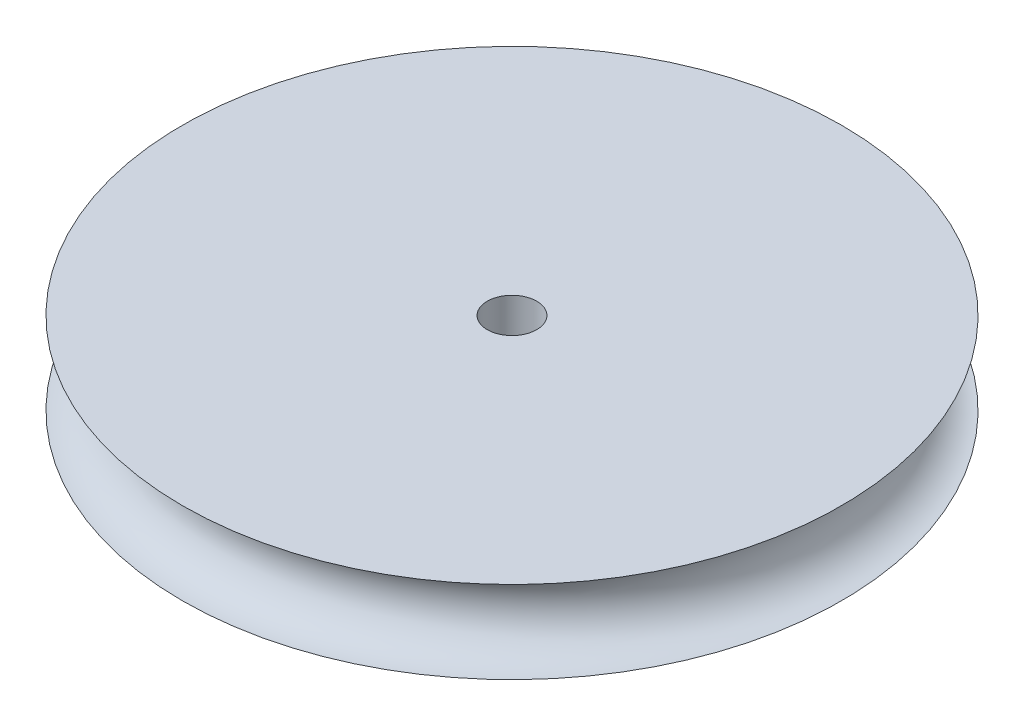
ISO-10303-21;
HEADER;
FILE_DESCRIPTION(('STEP AP214'),'2;1');
FILE_NAME('part.step','',(''),(''),'','','');
FILE_SCHEMA(('AUTOMOTIVE_DESIGN { 1 0 10303 214 1 1 1 1 }'));
ENDSEC;
DATA;
#1=APPLICATION_CONTEXT('core data for automotive mechanical design processes');
#2=APPLICATION_PROTOCOL_DEFINITION('international standard','automotive_design',2000,#1);
#3=PRODUCT_CONTEXT('',#1,'mechanical');
#4=PRODUCT('Part','Part','',(#3));
#5=PRODUCT_RELATED_PRODUCT_CATEGORY('part','',(#4));
#6=PRODUCT_DEFINITION_FORMATION('','',#4);
#7=PRODUCT_DEFINITION_CONTEXT('part definition',#1,'design');
#8=PRODUCT_DEFINITION('design','',#6,#7);
#9=PRODUCT_DEFINITION_SHAPE('','',#8);
#10=(LENGTH_UNIT() NAMED_UNIT(*) SI_UNIT(.MILLI.,.METRE.));
#11=(NAMED_UNIT(*) PLANE_ANGLE_UNIT() SI_UNIT($,.RADIAN.));
#12=(NAMED_UNIT(*) SI_UNIT($,.STERADIAN.) SOLID_ANGLE_UNIT());
#13=UNCERTAINTY_MEASURE_WITH_UNIT(LENGTH_MEASURE(1.E-05),#10,'distance_accuracy_value','');
#14=(GEOMETRIC_REPRESENTATION_CONTEXT(3) GLOBAL_UNCERTAINTY_ASSIGNED_CONTEXT((#13)) GLOBAL_UNIT_ASSIGNED_CONTEXT((#10,
#11,#12)) REPRESENTATION_CONTEXT('',''));
#15=CARTESIAN_POINT('',(0.,0.,0.));
#16=DIRECTION('',(0.,0.,1.));
#17=DIRECTION('',(1.,0.,0.));
#18=AXIS2_PLACEMENT_3D('',#15,#16,#17);
#19=CARTESIAN_POINT('',(0.,2.5,0.));
#20=DIRECTION('',(0.,-1.,0.));
#21=DIRECTION('',(0.,0.,-1.));
#22=AXIS2_PLACEMENT_3D('',#19,#20,#21);
#23=TOROIDAL_SURFACE('',#22,20.,2.5);
#24=CARTESIAN_POINT('',(0.,0.,0.));
#25=DIRECTION('',(0.,-1.,0.));
#26=DIRECTION('',(0.,0.,-1.));
#27=AXIS2_PLACEMENT_3D('',#24,#25,#26);
#28=CIRCLE('',#27,20.);
#29=CARTESIAN_POINT('',(0.,0.,-20.));
#30=VERTEX_POINT('',#29);
#31=EDGE_CURVE('E10',#30,#30,#28,.T.);
#32=ORIENTED_EDGE('',*,*,#31,.F.);
#33=EDGE_LOOP('',(#32));
#34=FACE_BOUND('',#33,.T.);
#35=CARTESIAN_POINT('',(0.,5.,0.));
#36=DIRECTION('',(0.,-1.,0.));
#37=DIRECTION('',(0.,0.,-1.));
#38=AXIS2_PLACEMENT_3D('',#35,#36,#37);
#39=CIRCLE('',#38,20.);
#40=CARTESIAN_POINT('',(0.,5.,-20.));
#41=VERTEX_POINT('',#40);
#42=EDGE_CURVE('E47',#41,#41,#39,.T.);
#43=ORIENTED_EDGE('',*,*,#42,.T.);
#44=EDGE_LOOP('',(#43));
#45=FACE_BOUND('',#44,.T.);
#46=ADVANCED_FACE('F33',(#34,#45),#23,.F.);
#47=CARTESIAN_POINT('',(-1.5,0.,0.));
#48=DIRECTION('',(0.,1.,0.));
#49=DIRECTION('',(0.,0.,1.));
#50=AXIS2_PLACEMENT_3D('',#47,#48,#49);
#51=PLANE('',#50);
#52=CARTESIAN_POINT('',(0.,0.,0.));
#53=DIRECTION('',(0.,-1.,0.));
#54=DIRECTION('',(0.,0.,-1.));
#55=AXIS2_PLACEMENT_3D('',#52,#53,#54);
#56=CIRCLE('',#55,1.5);
#57=CARTESIAN_POINT('',(0.,0.,-1.5));
#58=VERTEX_POINT('',#57);
#59=EDGE_CURVE('E39',#58,#58,#56,.T.);
#60=ORIENTED_EDGE('',*,*,#59,.F.);
#61=EDGE_LOOP('',(#60));
#62=FACE_BOUND('',#61,.T.);
#63=ORIENTED_EDGE('',*,*,#31,.T.);
#64=EDGE_LOOP('',(#63));
#65=FACE_BOUND('',#64,.T.);
#66=ADVANCED_FACE('F62',(#62,#65),#51,.F.);
#67=CARTESIAN_POINT('',(0.,0.,0.));
#68=DIRECTION('',(0.,-1.,0.));
#69=DIRECTION('',(0.,0.,-1.));
#70=AXIS2_PLACEMENT_3D('',#67,#68,#69);
#71=CYLINDRICAL_SURFACE('',#70,1.5);
#72=CARTESIAN_POINT('',(0.,5.,0.));
#73=DIRECTION('',(0.,-1.,0.));
#74=DIRECTION('',(0.,0.,-1.));
#75=AXIS2_PLACEMENT_3D('',#72,#73,#74);
#76=CIRCLE('',#75,1.5);
#77=CARTESIAN_POINT('',(0.,5.,-1.5));
#78=VERTEX_POINT('',#77);
#79=EDGE_CURVE('E43',#78,#78,#76,.T.);
#80=ORIENTED_EDGE('',*,*,#79,.F.);
#81=EDGE_LOOP('',(#80));
#82=FACE_BOUND('',#81,.T.);
#83=ORIENTED_EDGE('',*,*,#59,.T.);
#84=EDGE_LOOP('',(#83));
#85=FACE_BOUND('',#84,.T.);
#86=ADVANCED_FACE('F57',(#82,#85),#71,.F.);
#87=CARTESIAN_POINT('',(-20.,5.,0.));
#88=DIRECTION('',(0.,-1.,0.));
#89=DIRECTION('',(0.,0.,-1.));
#90=AXIS2_PLACEMENT_3D('',#87,#88,#89);
#91=PLANE('',#90);
#92=ORIENTED_EDGE('',*,*,#42,.F.);
#93=EDGE_LOOP('',(#92));
#94=FACE_BOUND('',#93,.T.);
#95=ORIENTED_EDGE('',*,*,#79,.T.);
#96=EDGE_LOOP('',(#95));
#97=FACE_BOUND('',#96,.T.);
#98=ADVANCED_FACE('F54',(#94,#97),#91,.F.);
#99=CLOSED_SHELL('',(#46,#66,#86,#98));
#100=MANIFOLD_SOLID_BREP('B2',#99);
#101=ADVANCED_BREP_SHAPE_REPRESENTATION('',(#18,#100),#14);
#102=SHAPE_DEFINITION_REPRESENTATION(#9,#101);
ENDSEC;
END-ISO-10303-21;
